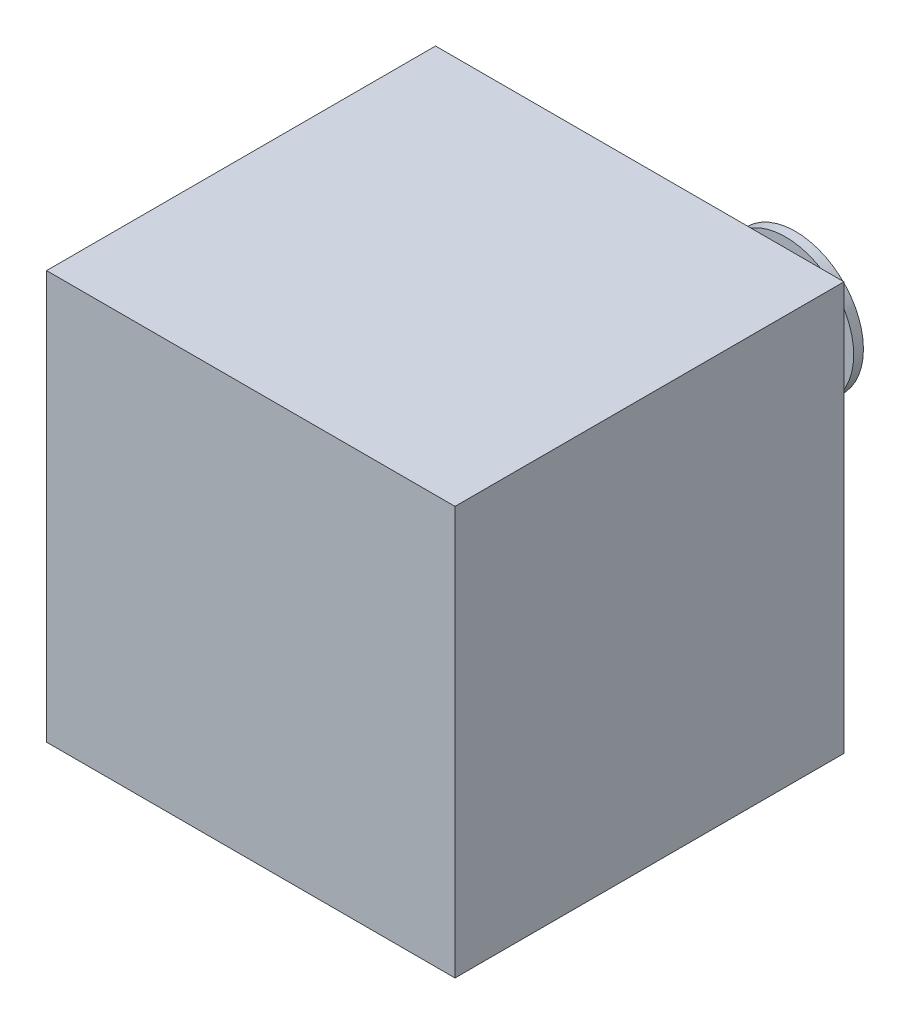
ISO-10303-21;
HEADER;
FILE_DESCRIPTION(('STEP AP214'),'2;1');
FILE_NAME('part.step','',(''),(''),'','','');
FILE_SCHEMA(('AUTOMOTIVE_DESIGN { 1 0 10303 214 1 1 1 1 }'));
ENDSEC;
DATA;
#1=APPLICATION_CONTEXT('core data for automotive mechanical design processes');
#2=APPLICATION_PROTOCOL_DEFINITION('international standard','automotive_design',2000,#1);
#3=PRODUCT_CONTEXT('',#1,'mechanical');
#4=PRODUCT('Part','Part','',(#3));
#5=PRODUCT_RELATED_PRODUCT_CATEGORY('part','',(#4));
#6=PRODUCT_DEFINITION_FORMATION('','',#4);
#7=PRODUCT_DEFINITION_CONTEXT('part definition',#1,'design');
#8=PRODUCT_DEFINITION('design','',#6,#7);
#9=PRODUCT_DEFINITION_SHAPE('','',#8);
#10=(LENGTH_UNIT() NAMED_UNIT(*) SI_UNIT(.MILLI.,.METRE.));
#11=(NAMED_UNIT(*) PLANE_ANGLE_UNIT() SI_UNIT($,.RADIAN.));
#12=(NAMED_UNIT(*) SI_UNIT($,.STERADIAN.) SOLID_ANGLE_UNIT());
#13=UNCERTAINTY_MEASURE_WITH_UNIT(LENGTH_MEASURE(1.E-05),#10,'distance_accuracy_value','');
#14=(GEOMETRIC_REPRESENTATION_CONTEXT(3) GLOBAL_UNCERTAINTY_ASSIGNED_CONTEXT((#13)) GLOBAL_UNIT_ASSIGNED_CONTEXT((#10,
#11,#12)) REPRESENTATION_CONTEXT('',''));
#15=CARTESIAN_POINT('',(0.,0.,0.));
#16=DIRECTION('',(0.,0.,1.));
#17=DIRECTION('',(1.,0.,0.));
#18=AXIS2_PLACEMENT_3D('',#15,#16,#17);
#19=CARTESIAN_POINT('',(-21.,-21.,40.));
#20=DIRECTION('',(-1.,0.,0.));
#21=DIRECTION('',(0.,0.,1.));
#22=AXIS2_PLACEMENT_3D('',#19,#20,#21);
#23=PLANE('',#22);
#24=DIRECTION('',(0.,1.,0.));
#25=VECTOR('',#24,1.);
#26=CARTESIAN_POINT('',(-21.,-21.,0.));
#27=LINE('',#26,#25);
#28=CARTESIAN_POINT('',(-21.,-21.,0.));
#29=VERTEX_POINT('',#28);
#30=CARTESIAN_POINT('',(-21.,21.,0.));
#31=VERTEX_POINT('',#30);
#32=EDGE_CURVE('E106',#29,#31,#27,.T.);
#33=ORIENTED_EDGE('',*,*,#32,.F.);
#34=DIRECTION('',(0.,0.,-1.));
#35=VECTOR('',#34,1.);
#36=CARTESIAN_POINT('',(-21.,-21.,40.));
#37=LINE('',#36,#35);
#38=CARTESIAN_POINT('',(-21.,-21.,40.));
#39=VERTEX_POINT('',#38);
#40=EDGE_CURVE('E53',#39,#29,#37,.T.);
#41=ORIENTED_EDGE('',*,*,#40,.F.);
#42=DIRECTION('',(0.,1.,0.));
#43=VECTOR('',#42,1.);
#44=CARTESIAN_POINT('',(-21.,-21.,40.));
#45=LINE('',#44,#43);
#46=CARTESIAN_POINT('',(-21.,21.,40.));
#47=VERTEX_POINT('',#46);
#48=EDGE_CURVE('E100',#39,#47,#45,.T.);
#49=ORIENTED_EDGE('',*,*,#48,.T.);
#50=DIRECTION('',(0.,0.,-1.));
#51=VECTOR('',#50,1.);
#52=CARTESIAN_POINT('',(-21.,21.,40.));
#53=LINE('',#52,#51);
#54=EDGE_CURVE('E78',#47,#31,#53,.T.);
#55=ORIENTED_EDGE('',*,*,#54,.T.);
#56=EDGE_LOOP('',(#33,#41,#49,#55));
#57=FACE_BOUND('',#56,.T.);
#58=ADVANCED_FACE('F37',(#57),#23,.T.);
#59=CARTESIAN_POINT('',(-21.,-21.,40.));
#60=DIRECTION('',(0.,1.,0.));
#61=DIRECTION('',(0.,0.,1.));
#62=AXIS2_PLACEMENT_3D('',#59,#60,#61);
#63=PLANE('',#62);
#64=DIRECTION('',(1.,0.,0.));
#65=VECTOR('',#64,1.);
#66=CARTESIAN_POINT('',(-21.,-21.,0.));
#67=LINE('',#66,#65);
#68=CARTESIAN_POINT('',(21.,-21.,0.));
#69=VERTEX_POINT('',#68);
#70=EDGE_CURVE('E70',#29,#69,#67,.T.);
#71=ORIENTED_EDGE('',*,*,#70,.T.);
#72=DIRECTION('',(0.,0.,-1.));
#73=VECTOR('',#72,1.);
#74=CARTESIAN_POINT('',(21.,-21.,40.));
#75=LINE('',#74,#73);
#76=CARTESIAN_POINT('',(21.,-21.,40.));
#77=VERTEX_POINT('',#76);
#78=EDGE_CURVE('E97',#77,#69,#75,.T.);
#79=ORIENTED_EDGE('',*,*,#78,.F.);
#80=DIRECTION('',(1.,0.,0.));
#81=VECTOR('',#80,1.);
#82=CARTESIAN_POINT('',(-21.,-21.,40.));
#83=LINE('',#82,#81);
#84=EDGE_CURVE('E88',#39,#77,#83,.T.);
#85=ORIENTED_EDGE('',*,*,#84,.F.);
#86=ORIENTED_EDGE('',*,*,#40,.T.);
#87=EDGE_LOOP('',(#71,#79,#85,#86));
#88=FACE_BOUND('',#87,.T.);
#89=ADVANCED_FACE('F163',(#88),#63,.F.);
#90=CARTESIAN_POINT('',(21.,-21.,40.));
#91=DIRECTION('',(-1.,0.,0.));
#92=DIRECTION('',(0.,0.,1.));
#93=AXIS2_PLACEMENT_3D('',#90,#91,#92);
#94=PLANE('',#93);
#95=DIRECTION('',(0.,1.,0.));
#96=VECTOR('',#95,1.);
#97=CARTESIAN_POINT('',(21.,-21.,0.));
#98=LINE('',#97,#96);
#99=CARTESIAN_POINT('',(21.,21.,0.));
#100=VERTEX_POINT('',#99);
#101=EDGE_CURVE('E95',#69,#100,#98,.T.);
#102=ORIENTED_EDGE('',*,*,#101,.T.);
#103=DIRECTION('',(0.,0.,-1.));
#104=VECTOR('',#103,1.);
#105=CARTESIAN_POINT('',(21.,21.,40.));
#106=LINE('',#105,#104);
#107=CARTESIAN_POINT('',(21.,21.,40.));
#108=VERTEX_POINT('',#107);
#109=EDGE_CURVE('E92',#108,#100,#106,.T.);
#110=ORIENTED_EDGE('',*,*,#109,.F.);
#111=DIRECTION('',(0.,1.,0.));
#112=VECTOR('',#111,1.);
#113=CARTESIAN_POINT('',(21.,-21.,40.));
#114=LINE('',#113,#112);
#115=EDGE_CURVE('E83',#77,#108,#114,.T.);
#116=ORIENTED_EDGE('',*,*,#115,.F.);
#117=ORIENTED_EDGE('',*,*,#78,.T.);
#118=EDGE_LOOP('',(#102,#110,#116,#117));
#119=FACE_BOUND('',#118,.T.);
#120=ADVANCED_FACE('F93',(#119),#94,.F.);
#121=CARTESIAN_POINT('',(-21.,21.,40.));
#122=DIRECTION('',(0.,1.,0.));
#123=DIRECTION('',(0.,0.,1.));
#124=AXIS2_PLACEMENT_3D('',#121,#122,#123);
#125=PLANE('',#124);
#126=DIRECTION('',(1.,0.,0.));
#127=VECTOR('',#126,1.);
#128=CARTESIAN_POINT('',(-21.,21.,0.));
#129=LINE('',#128,#127);
#130=EDGE_CURVE('E109',#31,#100,#129,.T.);
#131=ORIENTED_EDGE('',*,*,#130,.F.);
#132=ORIENTED_EDGE('',*,*,#54,.F.);
#133=DIRECTION('',(1.,0.,0.));
#134=VECTOR('',#133,1.);
#135=CARTESIAN_POINT('',(-21.,21.,40.));
#136=LINE('',#135,#134);
#137=EDGE_CURVE('E87',#47,#108,#136,.T.);
#138=ORIENTED_EDGE('',*,*,#137,.T.);
#139=ORIENTED_EDGE('',*,*,#109,.T.);
#140=EDGE_LOOP('',(#131,#132,#138,#139));
#141=FACE_BOUND('',#140,.T.);
#142=ADVANCED_FACE('F99',(#141),#125,.T.);
#143=CARTESIAN_POINT('',(0.,0.,40.));
#144=DIRECTION('',(0.,0.,-1.));
#145=DIRECTION('',(-1.,0.,0.));
#146=AXIS2_PLACEMENT_3D('',#143,#144,#145);
#147=PLANE('',#146);
#148=ORIENTED_EDGE('',*,*,#48,.F.);
#149=ORIENTED_EDGE('',*,*,#84,.T.);
#150=ORIENTED_EDGE('',*,*,#115,.T.);
#151=ORIENTED_EDGE('',*,*,#137,.F.);
#152=EDGE_LOOP('',(#148,#149,#150,#151));
#153=FACE_BOUND('',#152,.T.);
#154=ADVANCED_FACE('F86',(#153),#147,.F.);
#155=CARTESIAN_POINT('',(0.,0.,0.));
#156=DIRECTION('',(0.,0.,-1.));
#157=DIRECTION('',(-1.,0.,0.));
#158=AXIS2_PLACEMENT_3D('',#155,#156,#157);
#159=PLANE('',#158);
#160=CARTESIAN_POINT('',(0.,0.,0.));
#161=DIRECTION('',(0.,0.,-1.));
#162=DIRECTION('',(-1.,0.,0.));
#163=AXIS2_PLACEMENT_3D('',#160,#161,#162);
#164=CIRCLE('',#163,11.5);
#165=CARTESIAN_POINT('',(-11.5,0.,0.));
#166=VERTEX_POINT('',#165);
#167=EDGE_CURVE('E45',#166,#166,#164,.T.);
#168=ORIENTED_EDGE('',*,*,#167,.F.);
#169=EDGE_LOOP('',(#168));
#170=FACE_BOUND('',#169,.T.);
#171=ORIENTED_EDGE('',*,*,#32,.T.);
#172=ORIENTED_EDGE('',*,*,#130,.T.);
#173=ORIENTED_EDGE('',*,*,#101,.F.);
#174=ORIENTED_EDGE('',*,*,#70,.F.);
#175=EDGE_LOOP('',(#171,#172,#173,#174));
#176=FACE_BOUND('',#175,.T.);
#177=ADVANCED_FACE('F169',(#170,#176),#159,.T.);
#178=CARTESIAN_POINT('',(0.,0.,-2.));
#179=DIRECTION('',(0.,0.,1.));
#180=DIRECTION('',(1.,0.,0.));
#181=AXIS2_PLACEMENT_3D('',#178,#179,#180);
#182=CYLINDRICAL_SURFACE('',#181,11.5);
#183=CARTESIAN_POINT('',(0.,0.,-2.));
#184=DIRECTION('',(0.,0.,1.));
#185=DIRECTION('',(1.,0.,0.));
#186=AXIS2_PLACEMENT_3D('',#183,#184,#185);
#187=CIRCLE('',#186,11.5);
#188=CARTESIAN_POINT('',(11.5,0.,-2.));
#189=VERTEX_POINT('',#188);
#190=EDGE_CURVE('E110',#189,#189,#187,.T.);
#191=ORIENTED_EDGE('',*,*,#190,.T.);
#192=EDGE_LOOP('',(#191));
#193=FACE_BOUND('',#192,.T.);
#194=ORIENTED_EDGE('',*,*,#167,.T.);
#195=EDGE_LOOP('',(#194));
#196=FACE_BOUND('',#195,.T.);
#197=ADVANCED_FACE('F171',(#193,#196),#182,.T.);
#198=CARTESIAN_POINT('',(0.,0.,-2.));
#199=DIRECTION('',(0.,0.,1.));
#200=DIRECTION('',(1.,0.,0.));
#201=AXIS2_PLACEMENT_3D('',#198,#199,#200);
#202=PLANE('',#201);
#203=CARTESIAN_POINT('',(0.,0.,-2.));
#204=DIRECTION('',(0.,0.,1.));
#205=DIRECTION('',(1.,0.,0.));
#206=AXIS2_PLACEMENT_3D('',#203,#204,#205);
#207=CIRCLE('',#206,2.5);
#208=CARTESIAN_POINT('',(2.5,0.,-2.));
#209=VERTEX_POINT('',#208);
#210=EDGE_CURVE('E118',#209,#209,#207,.T.);
#211=ORIENTED_EDGE('',*,*,#210,.T.);
#212=EDGE_LOOP('',(#211));
#213=FACE_BOUND('',#212,.T.);
#214=ORIENTED_EDGE('',*,*,#190,.F.);
#215=EDGE_LOOP('',(#214));
#216=FACE_BOUND('',#215,.T.);
#217=ADVANCED_FACE('F178',(#213,#216),#202,.F.);
#218=CARTESIAN_POINT('',(0.,0.,-16.));
#219=DIRECTION('',(0.,0.,1.));
#220=DIRECTION('',(1.,0.,0.));
#221=AXIS2_PLACEMENT_3D('',#218,#219,#220);
#222=CYLINDRICAL_SURFACE('',#221,2.5);
#223=CARTESIAN_POINT('',(0.,0.,-7.99999999999998));
#224=DIRECTION('',(0.,0.,1.));
#225=DIRECTION('',(1.,0.,0.));
#226=AXIS2_PLACEMENT_3D('',#223,#224,#225);
#227=CIRCLE('',#226,2.5);
#228=CARTESIAN_POINT('',(2.5,0.,-7.99999999999999));
#229=VERTEX_POINT('',#228);
#230=EDGE_CURVE('E11',#229,#229,#227,.F.);
#231=ORIENTED_EDGE('',*,*,#230,.F.);
#232=EDGE_LOOP('',(#231));
#233=FACE_BOUND('',#232,.T.);
#234=ORIENTED_EDGE('',*,*,#210,.F.);
#235=EDGE_LOOP('',(#234));
#236=FACE_BOUND('',#235,.T.);
#237=ADVANCED_FACE('F213',(#233,#236),#222,.T.);
#238=CARTESIAN_POINT('',(3.49148133884313E-12,0.,1000.));
#239=DIRECTION('',(0.,0.,1.));
#240=DIRECTION('',(1.,0.,0.));
#241=AXIS2_PLACEMENT_3D('',#238,#239,#240);
#242=CYLINDRICAL_SURFACE('',#241,7.00000000000006);
#243=CARTESIAN_POINT('',(0.,0.,-16.));
#244=DIRECTION('',(0.,0.,1.));
#245=DIRECTION('',(1.,0.,0.));
#246=AXIS2_PLACEMENT_3D('',#243,#244,#245);
#247=CIRCLE('',#246,7.00000000000006);
#248=CARTESIAN_POINT('',(7.,0.,-16.));
#249=VERTEX_POINT('',#248);
#250=EDGE_CURVE('E120',#249,#249,#247,.T.);
#251=ORIENTED_EDGE('',*,*,#250,.T.);
#252=EDGE_LOOP('',(#251));
#253=FACE_BOUND('',#252,.T.);
#254=CARTESIAN_POINT('',(0.,0.,-14.9999999999999));
#255=DIRECTION('',(0.,0.,1.));
#256=DIRECTION('',(1.,0.,0.));
#257=AXIS2_PLACEMENT_3D('',#254,#255,#256);
#258=CIRCLE('',#257,7.00000000000005);
#259=CARTESIAN_POINT('',(7.,0.,-14.9999999999999));
#260=VERTEX_POINT('',#259);
#261=EDGE_CURVE('E125',#260,#260,#258,.T.);
#262=ORIENTED_EDGE('',*,*,#261,.F.);
#263=EDGE_LOOP('',(#262));
#264=FACE_BOUND('',#263,.T.);
#265=ADVANCED_FACE('F222',(#253,#264),#242,.T.);
#266=CARTESIAN_POINT('',(7.,0.,-15.));
#267=DIRECTION('',(0.,0.,1.));
#268=DIRECTION('',(1.,0.,0.));
#269=AXIS2_PLACEMENT_3D('',#266,#267,#268);
#270=PLANE('',#269);
#271=ORIENTED_EDGE('',*,*,#261,.T.);
#272=EDGE_LOOP('',(#271));
#273=FACE_BOUND('',#272,.T.);
#274=CARTESIAN_POINT('',(0.,0.,-14.9999999999999));
#275=DIRECTION('',(0.,0.,1.));
#276=DIRECTION('',(1.,0.,0.));
#277=AXIS2_PLACEMENT_3D('',#274,#275,#276);
#278=CIRCLE('',#277,6.00000000000005);
#279=CARTESIAN_POINT('',(6.,0.,-14.9999999999999));
#280=VERTEX_POINT('',#279);
#281=EDGE_CURVE('E130',#280,#280,#278,.T.);
#282=ORIENTED_EDGE('',*,*,#281,.F.);
#283=EDGE_LOOP('',(#282));
#284=FACE_BOUND('',#283,.T.);
#285=ADVANCED_FACE('F233',(#273,#284),#270,.T.);
#286=CARTESIAN_POINT('',(3.49148133884313E-12,0.,1000.));
#287=DIRECTION('',(0.,0.,1.));
#288=DIRECTION('',(1.,0.,0.));
#289=AXIS2_PLACEMENT_3D('',#286,#287,#288);
#290=CYLINDRICAL_SURFACE('',#289,6.00000000000004);
#291=ORIENTED_EDGE('',*,*,#281,.T.);
#292=EDGE_LOOP('',(#291));
#293=FACE_BOUND('',#292,.T.);
#294=CARTESIAN_POINT('',(0.,0.,-8.9999999999999));
#295=DIRECTION('',(0.,0.,1.));
#296=DIRECTION('',(1.,0.,0.));
#297=AXIS2_PLACEMENT_3D('',#294,#295,#296);
#298=CIRCLE('',#297,6.00000000000003);
#299=CARTESIAN_POINT('',(6.,0.,-8.99999999999992));
#300=VERTEX_POINT('',#299);
#301=EDGE_CURVE('E135',#300,#300,#298,.T.);
#302=ORIENTED_EDGE('',*,*,#301,.F.);
#303=EDGE_LOOP('',(#302));
#304=FACE_BOUND('',#303,.T.);
#305=ADVANCED_FACE('F159',(#293,#304),#290,.T.);
#306=CARTESIAN_POINT('',(6.,0.,-9.));
#307=DIRECTION('',(0.,0.,-1.));
#308=DIRECTION('',(-1.,0.,0.));
#309=AXIS2_PLACEMENT_3D('',#306,#307,#308);
#310=PLANE('',#309);
#311=ORIENTED_EDGE('',*,*,#301,.T.);
#312=EDGE_LOOP('',(#311));
#313=FACE_BOUND('',#312,.T.);
#314=CARTESIAN_POINT('',(0.,0.,-8.9999999999999));
#315=DIRECTION('',(0.,0.,1.));
#316=DIRECTION('',(1.,0.,0.));
#317=AXIS2_PLACEMENT_3D('',#314,#315,#316);
#318=CIRCLE('',#317,7.00000000000003);
#319=CARTESIAN_POINT('',(7.,0.,-8.99999999999992));
#320=VERTEX_POINT('',#319);
#321=EDGE_CURVE('E138',#320,#320,#318,.T.);
#322=ORIENTED_EDGE('',*,*,#321,.F.);
#323=EDGE_LOOP('',(#322));
#324=FACE_BOUND('',#323,.T.);
#325=ADVANCED_FACE('F150',(#313,#324),#310,.T.);
#326=CARTESIAN_POINT('',(3.49148133884313E-12,0.,1000.));
#327=DIRECTION('',(0.,0.,1.));
#328=DIRECTION('',(1.,0.,0.));
#329=AXIS2_PLACEMENT_3D('',#326,#327,#328);
#330=CYLINDRICAL_SURFACE('',#329,7.00000000000003);
#331=ORIENTED_EDGE('',*,*,#321,.T.);
#332=EDGE_LOOP('',(#331));
#333=FACE_BOUND('',#332,.T.);
#334=CARTESIAN_POINT('',(0.,0.,-8.00000000000001));
#335=DIRECTION('',(0.,0.,1.));
#336=DIRECTION('',(1.,0.,0.));
#337=AXIS2_PLACEMENT_3D('',#334,#335,#336);
#338=CIRCLE('',#337,7.00000000000003);
#339=CARTESIAN_POINT('',(7.,0.,-8.00000000000003));
#340=VERTEX_POINT('',#339);
#341=EDGE_CURVE('E141',#340,#340,#338,.T.);
#342=ORIENTED_EDGE('',*,*,#341,.F.);
#343=EDGE_LOOP('',(#342));
#344=FACE_BOUND('',#343,.T.);
#345=ADVANCED_FACE('F148',(#333,#344),#330,.T.);
#346=CARTESIAN_POINT('',(7.,0.,-8.00000000000001));
#347=DIRECTION('',(0.,0.,1.));
#348=DIRECTION('',(1.,0.,0.));
#349=AXIS2_PLACEMENT_3D('',#346,#347,#348);
#350=PLANE('',#349);
#351=ORIENTED_EDGE('',*,*,#341,.T.);
#352=EDGE_LOOP('',(#351));
#353=FACE_BOUND('',#352,.T.);
#354=ORIENTED_EDGE('',*,*,#230,.T.);
#355=EDGE_LOOP('',(#354));
#356=FACE_BOUND('',#355,.T.);
#357=ADVANCED_FACE('F145',(#353,#356),#350,.T.);
#358=CARTESIAN_POINT('',(0.,0.,-16.));
#359=DIRECTION('',(0.,0.,1.));
#360=DIRECTION('',(1.,0.,0.));
#361=AXIS2_PLACEMENT_3D('',#358,#359,#360);
#362=PLANE('',#361);
#363=ORIENTED_EDGE('',*,*,#250,.F.);
#364=EDGE_LOOP('',(#363));
#365=FACE_BOUND('',#364,.T.);
#366=ADVANCED_FACE('F157',(#365),#362,.F.);
#367=CLOSED_SHELL('',(#58,#89,#120,#142,#154,#177,#197,#217,#237,#265,#285,#305,#325,#345,#357,#366));
#368=MANIFOLD_SOLID_BREP('B2',#367);
#369=ADVANCED_BREP_SHAPE_REPRESENTATION('',(#18,#368),#14);
#370=SHAPE_DEFINITION_REPRESENTATION(#9,#369);
ENDSEC;
END-ISO-10303-21;
